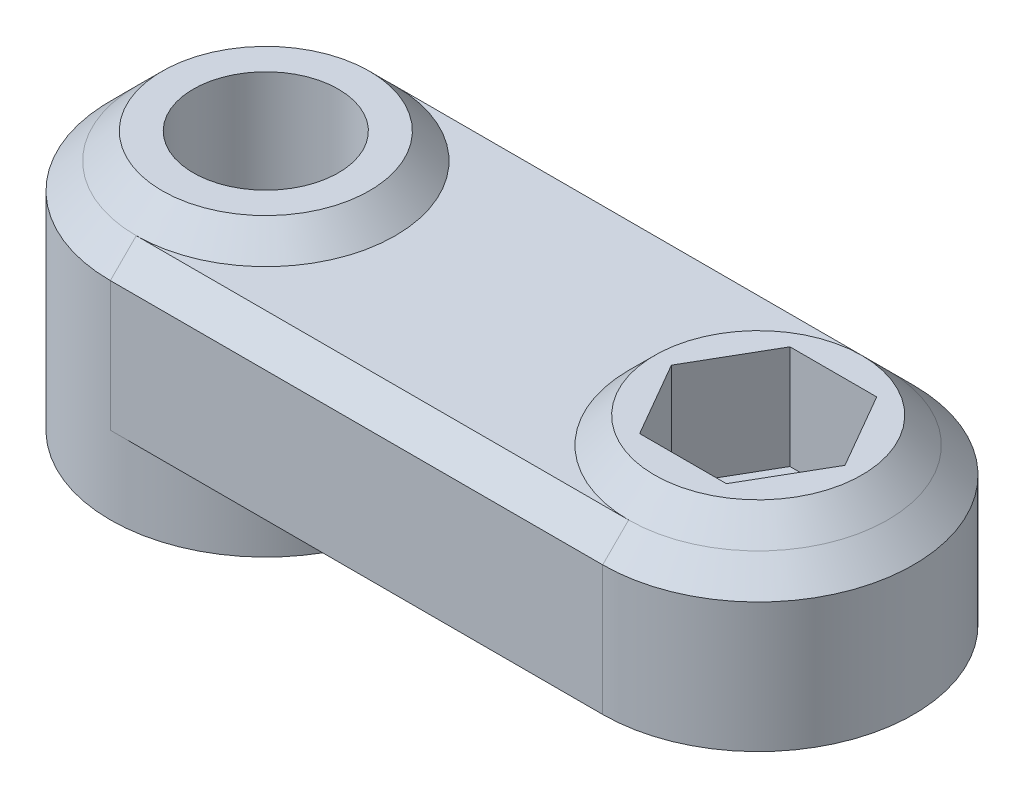
ISO-10303-21;
HEADER;
FILE_DESCRIPTION(('STEP AP214'),'2;1');
FILE_NAME('part.step','',(''),(''),'','','');
FILE_SCHEMA(('AUTOMOTIVE_DESIGN { 1 0 10303 214 1 1 1 1 }'));
ENDSEC;
DATA;
#1=APPLICATION_CONTEXT('core data for automotive mechanical design processes');
#2=APPLICATION_PROTOCOL_DEFINITION('international standard','automotive_design',2000,#1);
#3=PRODUCT_CONTEXT('',#1,'mechanical');
#4=PRODUCT('Part','Part','',(#3));
#5=PRODUCT_RELATED_PRODUCT_CATEGORY('part','',(#4));
#6=PRODUCT_DEFINITION_FORMATION('','',#4);
#7=PRODUCT_DEFINITION_CONTEXT('part definition',#1,'design');
#8=PRODUCT_DEFINITION('design','',#6,#7);
#9=PRODUCT_DEFINITION_SHAPE('','',#8);
#10=(LENGTH_UNIT() NAMED_UNIT(*) SI_UNIT(.MILLI.,.METRE.));
#11=(NAMED_UNIT(*) PLANE_ANGLE_UNIT() SI_UNIT($,.RADIAN.));
#12=(NAMED_UNIT(*) SI_UNIT($,.STERADIAN.) SOLID_ANGLE_UNIT());
#13=UNCERTAINTY_MEASURE_WITH_UNIT(LENGTH_MEASURE(1.E-05),#10,'distance_accuracy_value','');
#14=(GEOMETRIC_REPRESENTATION_CONTEXT(3) GLOBAL_UNCERTAINTY_ASSIGNED_CONTEXT((#13)) GLOBAL_UNIT_ASSIGNED_CONTEXT((#10,
#11,#12)) REPRESENTATION_CONTEXT('',''));
#15=CARTESIAN_POINT('',(0.,0.,0.));
#16=DIRECTION('',(0.,0.,1.));
#17=DIRECTION('',(1.,0.,0.));
#18=AXIS2_PLACEMENT_3D('',#15,#16,#17);
#19=CARTESIAN_POINT('',(0.,10.,0.));
#20=DIRECTION('',(0.,1.,0.));
#21=DIRECTION('',(0.,0.,1.));
#22=AXIS2_PLACEMENT_3D('',#19,#20,#21);
#23=PLANE('',#22);
#24=CARTESIAN_POINT('',(0.,10.,0.));
#25=DIRECTION('',(0.,-1.,0.));
#26=DIRECTION('',(0.,0.,-1.));
#27=AXIS2_PLACEMENT_3D('',#24,#25,#26);
#28=CIRCLE('',#27,2.8);
#29=CARTESIAN_POINT('',(0.,10.,-2.8));
#30=VERTEX_POINT('',#29);
#31=EDGE_CURVE('E314',#30,#30,#28,.T.);
#32=ORIENTED_EDGE('',*,*,#31,.T.);
#33=EDGE_LOOP('',(#32));
#34=FACE_BOUND('',#33,.T.);
#35=CARTESIAN_POINT('',(0.,10.,0.));
#36=DIRECTION('',(0.,1.,0.));
#37=DIRECTION('',(0.,0.,1.));
#38=AXIS2_PLACEMENT_3D('',#35,#36,#37);
#39=CIRCLE('',#38,4.);
#40=CARTESIAN_POINT('',(0.,10.,4.));
#41=VERTEX_POINT('',#40);
#42=EDGE_CURVE('E340',#41,#41,#39,.T.);
#43=ORIENTED_EDGE('',*,*,#42,.T.);
#44=EDGE_LOOP('',(#43));
#45=FACE_BOUND('',#44,.T.);
#46=ADVANCED_FACE('F41',(#34,#45),#23,.T.);
#47=DIRECTION('',(-0.5,0.,-0.866025403784439));
#48=VECTOR('',#47,1.);
#49=CARTESIAN_POINT('',(22.3486315612998,10.,0.));
#50=LINE('',#49,#48);
#51=CARTESIAN_POINT('',(22.3486315612998,10.,0.));
#52=VERTEX_POINT('',#51);
#53=CARTESIAN_POINT('',(20.6743157806499,10.,-2.9));
#54=VERTEX_POINT('',#53);
#55=EDGE_CURVE('E64',#52,#54,#50,.T.);
#56=ORIENTED_EDGE('',*,*,#55,.F.);
#57=DIRECTION('',(0.5,0.,-0.866025403784438));
#58=VECTOR('',#57,1.);
#59=CARTESIAN_POINT('',(20.6743157806499,10.,2.90000000000001));
#60=LINE('',#59,#58);
#61=CARTESIAN_POINT('',(20.6743157806499,10.,2.90000000000001));
#62=VERTEX_POINT('',#61);
#63=EDGE_CURVE('E379',#62,#52,#60,.T.);
#64=ORIENTED_EDGE('',*,*,#63,.F.);
#65=DIRECTION('',(1.,0.,0.));
#66=VECTOR('',#65,1.);
#67=CARTESIAN_POINT('',(17.3256842193501,10.,2.90000000000001));
#68=LINE('',#67,#66);
#69=CARTESIAN_POINT('',(17.3256842193501,10.,2.90000000000001));
#70=VERTEX_POINT('',#69);
#71=EDGE_CURVE('E410',#70,#62,#68,.T.);
#72=ORIENTED_EDGE('',*,*,#71,.F.);
#73=DIRECTION('',(0.5,0.,0.866025403784438));
#74=VECTOR('',#73,1.);
#75=CARTESIAN_POINT('',(15.6513684387002,10.,0.));
#76=LINE('',#75,#74);
#77=CARTESIAN_POINT('',(15.6513684387002,10.,0.));
#78=VERTEX_POINT('',#77);
#79=EDGE_CURVE('E406',#78,#70,#76,.T.);
#80=ORIENTED_EDGE('',*,*,#79,.F.);
#81=DIRECTION('',(-0.500000000000001,0.,0.866025403784438));
#82=VECTOR('',#81,1.);
#83=CARTESIAN_POINT('',(17.3256842193501,10.,-2.9));
#84=LINE('',#83,#82);
#85=CARTESIAN_POINT('',(17.3256842193501,10.,-2.9));
#86=VERTEX_POINT('',#85);
#87=EDGE_CURVE('E402',#86,#78,#84,.T.);
#88=ORIENTED_EDGE('',*,*,#87,.F.);
#89=DIRECTION('',(-1.,0.,0.));
#90=VECTOR('',#89,1.);
#91=CARTESIAN_POINT('',(20.6743157806499,10.,-2.9));
#92=LINE('',#91,#90);
#93=EDGE_CURVE('E370',#54,#86,#92,.T.);
#94=ORIENTED_EDGE('',*,*,#93,.F.);
#95=EDGE_LOOP('',(#56,#64,#72,#80,#88,#94));
#96=FACE_BOUND('',#95,.T.);
#97=CARTESIAN_POINT('',(19.,10.,0.));
#98=DIRECTION('',(0.,1.,0.));
#99=DIRECTION('',(0.,0.,1.));
#100=AXIS2_PLACEMENT_3D('',#97,#98,#99);
#101=CIRCLE('',#100,3.99999999999999);
#102=CARTESIAN_POINT('',(19.,10.,3.99999999999999));
#103=VERTEX_POINT('',#102);
#104=EDGE_CURVE('E336',#103,#103,#101,.T.);
#105=ORIENTED_EDGE('',*,*,#104,.T.);
#106=EDGE_LOOP('',(#105));
#107=FACE_BOUND('',#106,.T.);
#108=ADVANCED_FACE('F436',(#96,#107),#23,.T.);
#109=CARTESIAN_POINT('',(0.,10.,4.));
#110=DIRECTION('',(0.,0.707106781186546,0.707106781186549));
#111=DIRECTION('',(-1.,0.,0.));
#112=AXIS2_PLACEMENT_3D('',#109,#110,#111);
#113=PLANE('',#112);
#114=DIRECTION('',(0.,-0.707106781186549,0.707106781186546));
#115=VECTOR('',#114,1.);
#116=CARTESIAN_POINT('',(19.,10.,3.99999999999999));
#117=LINE('',#116,#115);
#118=CARTESIAN_POINT('',(19.,9.,4.99999999999999));
#119=VERTEX_POINT('',#118);
#120=CARTESIAN_POINT('',(19.,7.99999999999999,6.));
#121=VERTEX_POINT('',#120);
#122=EDGE_CURVE('E212',#119,#121,#117,.T.);
#123=ORIENTED_EDGE('',*,*,#122,.F.);
#124=DIRECTION('',(-1.,0.,0.));
#125=VECTOR('',#124,1.);
#126=CARTESIAN_POINT('',(0.,9.,4.99999999999999));
#127=LINE('',#126,#125);
#128=CARTESIAN_POINT('',(0.,9.,4.99999999999999));
#129=VERTEX_POINT('',#128);
#130=EDGE_CURVE('E365',#119,#129,#127,.T.);
#131=ORIENTED_EDGE('',*,*,#130,.T.);
#132=DIRECTION('',(0.,0.707106781186549,-0.707106781186546));
#133=VECTOR('',#132,1.);
#134=CARTESIAN_POINT('',(0.,7.99999999999999,6.));
#135=LINE('',#134,#133);
#136=CARTESIAN_POINT('',(0.,7.99999999999999,6.));
#137=VERTEX_POINT('',#136);
#138=EDGE_CURVE('E190',#137,#129,#135,.T.);
#139=ORIENTED_EDGE('',*,*,#138,.F.);
#140=DIRECTION('',(-1.,0.,0.));
#141=VECTOR('',#140,1.);
#142=CARTESIAN_POINT('',(0.,7.99999999999999,6.));
#143=LINE('',#142,#141);
#144=EDGE_CURVE('E181',#121,#137,#143,.T.);
#145=ORIENTED_EDGE('',*,*,#144,.F.);
#146=EDGE_LOOP('',(#123,#131,#139,#145));
#147=FACE_BOUND('',#146,.T.);
#148=ADVANCED_FACE('F364',(#147),#113,.T.);
#149=CARTESIAN_POINT('',(19.,10.,0.));
#150=DIRECTION('',(0.,-1.,0.));
#151=DIRECTION('',(0.,0.,-1.));
#152=AXIS2_PLACEMENT_3D('',#149,#150,#151);
#153=CONICAL_SURFACE('',#152,3.99999999999999,0.785398163397447);
#154=DIRECTION('',(0.,-0.707106781186549,-0.707106781186546));
#155=VECTOR('',#154,1.);
#156=CARTESIAN_POINT('',(19.,10.,-3.99999999999999));
#157=LINE('',#156,#155);
#158=CARTESIAN_POINT('',(19.,9.,-4.99999999999999));
#159=VERTEX_POINT('',#158);
#160=CARTESIAN_POINT('',(19.,7.99999999999999,-6.));
#161=VERTEX_POINT('',#160);
#162=EDGE_CURVE('E198',#159,#161,#157,.T.);
#163=ORIENTED_EDGE('',*,*,#162,.F.);
#164=CARTESIAN_POINT('',(19.,9.,0.));
#165=DIRECTION('',(0.,1.,0.));
#166=DIRECTION('',(0.,0.,1.));
#167=AXIS2_PLACEMENT_3D('',#164,#165,#166);
#168=CIRCLE('',#167,4.99999999999999);
#169=EDGE_CURVE('E57',#159,#119,#168,.F.);
#170=ORIENTED_EDGE('',*,*,#169,.T.);
#171=ORIENTED_EDGE('',*,*,#122,.T.);
#172=CARTESIAN_POINT('',(19.,7.99999999999999,0.));
#173=DIRECTION('',(0.,1.,0.));
#174=DIRECTION('',(0.,0.,1.));
#175=AXIS2_PLACEMENT_3D('',#172,#173,#174);
#176=CIRCLE('',#175,6.);
#177=EDGE_CURVE('E348',#161,#121,#176,.F.);
#178=ORIENTED_EDGE('',*,*,#177,.F.);
#179=EDGE_LOOP('',(#163,#170,#171,#178));
#180=FACE_BOUND('',#179,.T.);
#181=ADVANCED_FACE('F502',(#180),#153,.T.);
#182=CARTESIAN_POINT('',(0.,10.,0.));
#183=DIRECTION('',(0.,-1.,0.));
#184=DIRECTION('',(0.,0.,-1.));
#185=AXIS2_PLACEMENT_3D('',#182,#183,#184);
#186=CONICAL_SURFACE('',#185,4.,0.785398163397447);
#187=ORIENTED_EDGE('',*,*,#138,.T.);
#188=CARTESIAN_POINT('',(0.,9.,0.));
#189=DIRECTION('',(0.,1.,0.));
#190=DIRECTION('',(0.,0.,1.));
#191=AXIS2_PLACEMENT_3D('',#188,#189,#190);
#192=CIRCLE('',#191,4.99999999999999);
#193=CARTESIAN_POINT('',(0.,9.,-4.99999999999999));
#194=VERTEX_POINT('',#193);
#195=EDGE_CURVE('E170',#129,#194,#192,.F.);
#196=ORIENTED_EDGE('',*,*,#195,.T.);
#197=DIRECTION('',(0.,0.707106781186549,0.707106781186546));
#198=VECTOR('',#197,1.);
#199=CARTESIAN_POINT('',(0.,7.99999999999999,-6.));
#200=LINE('',#199,#198);
#201=CARTESIAN_POINT('',(0.,7.99999999999999,-6.));
#202=VERTEX_POINT('',#201);
#203=EDGE_CURVE('E188',#202,#194,#200,.T.);
#204=ORIENTED_EDGE('',*,*,#203,.F.);
#205=CARTESIAN_POINT('',(0.,7.99999999999999,0.));
#206=DIRECTION('',(0.,1.,0.));
#207=DIRECTION('',(0.,0.,1.));
#208=AXIS2_PLACEMENT_3D('',#205,#206,#207);
#209=CIRCLE('',#208,6.);
#210=EDGE_CURVE('E346',#137,#202,#209,.F.);
#211=ORIENTED_EDGE('',*,*,#210,.F.);
#212=EDGE_LOOP('',(#187,#196,#204,#211));
#213=FACE_BOUND('',#212,.T.);
#214=ADVANCED_FACE('F186',(#213),#186,.T.);
#215=CARTESIAN_POINT('',(0.,10.,-4.));
#216=DIRECTION('',(0.,0.707106781186546,-0.707106781186549));
#217=DIRECTION('',(1.,0.,0.));
#218=AXIS2_PLACEMENT_3D('',#215,#216,#217);
#219=PLANE('',#218);
#220=ORIENTED_EDGE('',*,*,#203,.T.);
#221=DIRECTION('',(1.,0.,0.));
#222=VECTOR('',#221,1.);
#223=CARTESIAN_POINT('',(0.,9.,-4.99999999999999));
#224=LINE('',#223,#222);
#225=EDGE_CURVE('E174',#194,#159,#224,.T.);
#226=ORIENTED_EDGE('',*,*,#225,.T.);
#227=ORIENTED_EDGE('',*,*,#162,.T.);
#228=DIRECTION('',(1.,0.,0.));
#229=VECTOR('',#228,1.);
#230=CARTESIAN_POINT('',(19.,7.99999999999999,-6.));
#231=LINE('',#230,#229);
#232=EDGE_CURVE('E196',#202,#161,#231,.T.);
#233=ORIENTED_EDGE('',*,*,#232,.F.);
#234=EDGE_LOOP('',(#220,#226,#227,#233));
#235=FACE_BOUND('',#234,.T.);
#236=ADVANCED_FACE('F194',(#235),#219,.T.);
#237=CARTESIAN_POINT('',(0.,10.,6.));
#238=DIRECTION('',(0.,0.,-1.));
#239=DIRECTION('',(-1.,0.,0.));
#240=AXIS2_PLACEMENT_3D('',#237,#238,#239);
#241=PLANE('',#240);
#242=DIRECTION('',(-1.,0.,0.));
#243=VECTOR('',#242,1.);
#244=CARTESIAN_POINT('',(0.,3.,6.));
#245=LINE('',#244,#243);
#246=CARTESIAN_POINT('',(19.,3.,6.));
#247=VERTEX_POINT('',#246);
#248=CARTESIAN_POINT('',(0.,3.,6.));
#249=VERTEX_POINT('',#248);
#250=EDGE_CURVE('E243',#247,#249,#245,.T.);
#251=ORIENTED_EDGE('',*,*,#250,.F.);
#252=DIRECTION('',(0.,-1.,0.));
#253=VECTOR('',#252,1.);
#254=CARTESIAN_POINT('',(19.,10.,6.));
#255=LINE('',#254,#253);
#256=EDGE_CURVE('E329',#121,#247,#255,.T.);
#257=ORIENTED_EDGE('',*,*,#256,.F.);
#258=ORIENTED_EDGE('',*,*,#144,.T.);
#259=DIRECTION('',(0.,-1.,0.));
#260=VECTOR('',#259,1.);
#261=CARTESIAN_POINT('',(0.,10.,6.));
#262=LINE('',#261,#260);
#263=EDGE_CURVE('E333',#137,#249,#262,.T.);
#264=ORIENTED_EDGE('',*,*,#263,.T.);
#265=EDGE_LOOP('',(#251,#257,#258,#264));
#266=FACE_BOUND('',#265,.T.);
#267=ADVANCED_FACE('F359',(#266),#241,.F.);
#268=CARTESIAN_POINT('',(19.,10.,0.));
#269=DIRECTION('',(0.,-1.,0.));
#270=DIRECTION('',(0.,0.,-1.));
#271=AXIS2_PLACEMENT_3D('',#268,#269,#270);
#272=CYLINDRICAL_SURFACE('',#271,6.);
#273=CARTESIAN_POINT('',(19.,3.,0.));
#274=DIRECTION('',(0.,-1.,0.));
#275=DIRECTION('',(0.,0.,-1.));
#276=AXIS2_PLACEMENT_3D('',#273,#274,#275);
#277=CIRCLE('',#276,6.);
#278=CARTESIAN_POINT('',(19.,3.,-6.));
#279=VERTEX_POINT('',#278);
#280=EDGE_CURVE('E225',#279,#247,#277,.T.);
#281=ORIENTED_EDGE('',*,*,#280,.F.);
#282=DIRECTION('',(0.,-1.,0.));
#283=VECTOR('',#282,1.);
#284=CARTESIAN_POINT('',(19.,10.,-6.));
#285=LINE('',#284,#283);
#286=EDGE_CURVE('E325',#161,#279,#285,.T.);
#287=ORIENTED_EDGE('',*,*,#286,.F.);
#288=ORIENTED_EDGE('',*,*,#177,.T.);
#289=ORIENTED_EDGE('',*,*,#256,.T.);
#290=EDGE_LOOP('',(#281,#287,#288,#289));
#291=FACE_BOUND('',#290,.T.);
#292=ADVANCED_FACE('F481',(#291),#272,.T.);
#293=CARTESIAN_POINT('',(0.,10.,-6.));
#294=DIRECTION('',(0.,0.,1.));
#295=DIRECTION('',(1.,0.,0.));
#296=AXIS2_PLACEMENT_3D('',#293,#294,#295);
#297=PLANE('',#296);
#298=DIRECTION('',(1.,0.,0.));
#299=VECTOR('',#298,1.);
#300=CARTESIAN_POINT('',(0.,3.,-6.));
#301=LINE('',#300,#299);
#302=CARTESIAN_POINT('',(0.,3.,-6.));
#303=VERTEX_POINT('',#302);
#304=EDGE_CURVE('E219',#303,#279,#301,.T.);
#305=ORIENTED_EDGE('',*,*,#304,.F.);
#306=DIRECTION('',(0.,-1.,0.));
#307=VECTOR('',#306,1.);
#308=CARTESIAN_POINT('',(0.,10.,-6.));
#309=LINE('',#308,#307);
#310=EDGE_CURVE('E322',#202,#303,#309,.T.);
#311=ORIENTED_EDGE('',*,*,#310,.F.);
#312=ORIENTED_EDGE('',*,*,#232,.T.);
#313=ORIENTED_EDGE('',*,*,#286,.T.);
#314=EDGE_LOOP('',(#305,#311,#312,#313));
#315=FACE_BOUND('',#314,.T.);
#316=ADVANCED_FACE('F477',(#315),#297,.F.);
#317=CARTESIAN_POINT('',(0.,0.,0.));
#318=DIRECTION('',(0.,1.,0.));
#319=DIRECTION('',(0.,0.,1.));
#320=AXIS2_PLACEMENT_3D('',#317,#318,#319);
#321=PLANE('',#320);
#322=DIRECTION('',(-1.,0.,0.));
#323=VECTOR('',#322,1.);
#324=CARTESIAN_POINT('',(2.10732848254213,0.,3.65));
#325=LINE('',#324,#323);
#326=CARTESIAN_POINT('',(2.10732848254213,0.,3.65));
#327=VERTEX_POINT('',#326);
#328=CARTESIAN_POINT('',(-2.10732848254214,0.,3.65));
#329=VERTEX_POINT('',#328);
#330=EDGE_CURVE('E275',#327,#329,#325,.T.);
#331=ORIENTED_EDGE('',*,*,#330,.F.);
#332=DIRECTION('',(-0.5,0.,0.866025403784438));
#333=VECTOR('',#332,1.);
#334=CARTESIAN_POINT('',(4.21465696508427,0.,0.));
#335=LINE('',#334,#333);
#336=CARTESIAN_POINT('',(4.21465696508427,0.,0.));
#337=VERTEX_POINT('',#336);
#338=EDGE_CURVE('E246',#337,#327,#335,.T.);
#339=ORIENTED_EDGE('',*,*,#338,.F.);
#340=DIRECTION('',(0.5,0.,0.866025403784438));
#341=VECTOR('',#340,1.);
#342=CARTESIAN_POINT('',(2.10732848254213,0.,-3.65));
#343=LINE('',#342,#341);
#344=CARTESIAN_POINT('',(2.10732848254213,0.,-3.65));
#345=VERTEX_POINT('',#344);
#346=EDGE_CURVE('E252',#345,#337,#343,.T.);
#347=ORIENTED_EDGE('',*,*,#346,.F.);
#348=DIRECTION('',(1.,0.,0.));
#349=VECTOR('',#348,1.);
#350=CARTESIAN_POINT('',(-2.10732848254213,0.,-3.65));
#351=LINE('',#350,#349);
#352=CARTESIAN_POINT('',(-2.10732848254213,0.,-3.65));
#353=VERTEX_POINT('',#352);
#354=EDGE_CURVE('E287',#353,#345,#351,.T.);
#355=ORIENTED_EDGE('',*,*,#354,.F.);
#356=DIRECTION('',(0.5,0.,-0.866025403784439));
#357=VECTOR('',#356,1.);
#358=CARTESIAN_POINT('',(-4.21465696508427,0.,0.));
#359=LINE('',#358,#357);
#360=CARTESIAN_POINT('',(-4.21465696508427,0.,0.));
#361=VERTEX_POINT('',#360);
#362=EDGE_CURVE('E283',#361,#353,#359,.T.);
#363=ORIENTED_EDGE('',*,*,#362,.F.);
#364=DIRECTION('',(-0.5,0.,-0.866025403784439));
#365=VECTOR('',#364,1.);
#366=CARTESIAN_POINT('',(-2.10732848254214,0.,3.65));
#367=LINE('',#366,#365);
#368=EDGE_CURVE('E279',#329,#361,#367,.T.);
#369=ORIENTED_EDGE('',*,*,#368,.F.);
#370=EDGE_LOOP('',(#331,#339,#347,#355,#363,#369));
#371=FACE_BOUND('',#370,.T.);
#372=CARTESIAN_POINT('',(0.,0.,0.));
#373=DIRECTION('',(0.,1.,0.));
#374=DIRECTION('',(0.,0.,1.));
#375=AXIS2_PLACEMENT_3D('',#372,#373,#374);
#376=CIRCLE('',#375,6.);
#377=CARTESIAN_POINT('',(0.,0.,6.));
#378=VERTEX_POINT('',#377);
#379=EDGE_CURVE('E318',#378,#378,#376,.T.);
#380=ORIENTED_EDGE('',*,*,#379,.F.);
#381=EDGE_LOOP('',(#380));
#382=FACE_BOUND('',#381,.T.);
#383=ADVANCED_FACE('F473',(#371,#382),#321,.F.);
#384=CARTESIAN_POINT('',(19.,0.,0.));
#385=DIRECTION('',(0.,-1.,0.));
#386=DIRECTION('',(0.,0.,-1.));
#387=AXIS2_PLACEMENT_3D('',#384,#385,#386);
#388=CYLINDRICAL_SURFACE('',#387,2.325);
#389=CARTESIAN_POINT('',(19.,6.,0.));
#390=DIRECTION('',(0.,-1.,0.));
#391=DIRECTION('',(0.,0.,-1.));
#392=AXIS2_PLACEMENT_3D('',#389,#390,#391);
#393=CIRCLE('',#392,2.325);
#394=CARTESIAN_POINT('',(19.,6.,-2.325));
#395=VERTEX_POINT('',#394);
#396=EDGE_CURVE('E215',#395,#395,#393,.T.);
#397=ORIENTED_EDGE('',*,*,#396,.F.);
#398=EDGE_LOOP('',(#397));
#399=FACE_BOUND('',#398,.T.);
#400=CARTESIAN_POINT('',(19.,3.,0.));
#401=DIRECTION('',(0.,-1.,0.));
#402=DIRECTION('',(0.,0.,-1.));
#403=AXIS2_PLACEMENT_3D('',#400,#401,#402);
#404=CIRCLE('',#403,2.325);
#405=CARTESIAN_POINT('',(19.,3.,-2.325));
#406=VERTEX_POINT('',#405);
#407=EDGE_CURVE('E216',#406,#406,#404,.T.);
#408=ORIENTED_EDGE('',*,*,#407,.T.);
#409=EDGE_LOOP('',(#408));
#410=FACE_BOUND('',#409,.T.);
#411=ADVANCED_FACE('F476',(#399,#410),#388,.F.);
#412=CARTESIAN_POINT('',(0.,10.,0.));
#413=DIRECTION('',(0.,-1.,0.));
#414=DIRECTION('',(0.,0.,-1.));
#415=AXIS2_PLACEMENT_3D('',#412,#413,#414);
#416=CYLINDRICAL_SURFACE('',#415,6.);
#417=ORIENTED_EDGE('',*,*,#379,.T.);
#418=EDGE_LOOP('',(#417));
#419=FACE_BOUND('',#418,.T.);
#420=CARTESIAN_POINT('',(0.,3.,0.));
#421=DIRECTION('',(0.,-1.,0.));
#422=DIRECTION('',(0.,0.,-1.));
#423=AXIS2_PLACEMENT_3D('',#420,#421,#422);
#424=CIRCLE('',#423,6.);
#425=EDGE_CURVE('E220',#303,#249,#424,.T.);
#426=ORIENTED_EDGE('',*,*,#425,.T.);
#427=ORIENTED_EDGE('',*,*,#263,.F.);
#428=ORIENTED_EDGE('',*,*,#210,.T.);
#429=ORIENTED_EDGE('',*,*,#310,.T.);
#430=EDGE_LOOP('',(#426,#427,#428,#429));
#431=FACE_BOUND('',#430,.T.);
#432=ADVANCED_FACE('F362',(#419,#431),#416,.T.);
#433=CARTESIAN_POINT('',(0.,-1.42756695835224,0.));
#434=DIRECTION('',(0.,-1.,0.));
#435=DIRECTION('',(0.,0.,-1.));
#436=AXIS2_PLACEMENT_3D('',#433,#434,#435);
#437=CYLINDRICAL_SURFACE('',#436,2.8);
#438=CARTESIAN_POINT('',(0.,5.,0.));
#439=DIRECTION('',(0.,-1.,0.));
#440=DIRECTION('',(0.,0.,-1.));
#441=AXIS2_PLACEMENT_3D('',#438,#439,#440);
#442=CIRCLE('',#441,2.8);
#443=CARTESIAN_POINT('',(0.,5.,-2.8));
#444=VERTEX_POINT('',#443);
#445=EDGE_CURVE('E199',#444,#444,#442,.T.);
#446=ORIENTED_EDGE('',*,*,#445,.T.);
#447=EDGE_LOOP('',(#446));
#448=FACE_BOUND('',#447,.T.);
#449=ORIENTED_EDGE('',*,*,#31,.F.);
#450=EDGE_LOOP('',(#449));
#451=FACE_BOUND('',#450,.T.);
#452=ADVANCED_FACE('F471',(#448,#451),#437,.F.);
#453=CARTESIAN_POINT('',(16.675,6.,0.));
#454=DIRECTION('',(0.,1.,0.));
#455=DIRECTION('',(0.,0.,1.));
#456=AXIS2_PLACEMENT_3D('',#453,#454,#455);
#457=PLANE('',#456);
#458=ORIENTED_EDGE('',*,*,#396,.T.);
#459=EDGE_LOOP('',(#458));
#460=FACE_BOUND('',#459,.T.);
#461=DIRECTION('',(-0.5,0.,-0.866025403784439));
#462=VECTOR('',#461,1.);
#463=CARTESIAN_POINT('',(22.3486315612998,6.,0.));
#464=LINE('',#463,#462);
#465=CARTESIAN_POINT('',(22.3486315612998,6.,0.));
#466=VERTEX_POINT('',#465);
#467=CARTESIAN_POINT('',(20.6743157806499,6.,-2.9));
#468=VERTEX_POINT('',#467);
#469=EDGE_CURVE('E374',#466,#468,#464,.T.);
#470=ORIENTED_EDGE('',*,*,#469,.T.);
#471=DIRECTION('',(-1.,0.,0.));
#472=VECTOR('',#471,1.);
#473=CARTESIAN_POINT('',(20.6743157806499,6.,-2.9));
#474=LINE('',#473,#472);
#475=CARTESIAN_POINT('',(17.3256842193501,6.,-2.9));
#476=VERTEX_POINT('',#475);
#477=EDGE_CURVE('E378',#468,#476,#474,.T.);
#478=ORIENTED_EDGE('',*,*,#477,.T.);
#479=DIRECTION('',(-0.500000000000001,0.,0.866025403784438));
#480=VECTOR('',#479,1.);
#481=CARTESIAN_POINT('',(17.3256842193501,6.,-2.9));
#482=LINE('',#481,#480);
#483=CARTESIAN_POINT('',(15.6513684387002,6.,0.));
#484=VERTEX_POINT('',#483);
#485=EDGE_CURVE('E383',#476,#484,#482,.T.);
#486=ORIENTED_EDGE('',*,*,#485,.T.);
#487=DIRECTION('',(0.5,0.,0.866025403784438));
#488=VECTOR('',#487,1.);
#489=CARTESIAN_POINT('',(15.6513684387002,6.,0.));
#490=LINE('',#489,#488);
#491=CARTESIAN_POINT('',(17.3256842193501,6.,2.90000000000001));
#492=VERTEX_POINT('',#491);
#493=EDGE_CURVE('E387',#484,#492,#490,.T.);
#494=ORIENTED_EDGE('',*,*,#493,.T.);
#495=DIRECTION('',(1.,0.,0.));
#496=VECTOR('',#495,1.);
#497=CARTESIAN_POINT('',(17.3256842193501,6.,2.90000000000001));
#498=LINE('',#497,#496);
#499=CARTESIAN_POINT('',(20.6743157806499,6.,2.90000000000001));
#500=VERTEX_POINT('',#499);
#501=EDGE_CURVE('E391',#492,#500,#498,.T.);
#502=ORIENTED_EDGE('',*,*,#501,.T.);
#503=DIRECTION('',(0.5,0.,-0.866025403784438));
#504=VECTOR('',#503,1.);
#505=CARTESIAN_POINT('',(20.6743157806499,6.,2.90000000000001));
#506=LINE('',#505,#504);
#507=EDGE_CURVE('E395',#500,#466,#506,.T.);
#508=ORIENTED_EDGE('',*,*,#507,.T.);
#509=EDGE_LOOP('',(#470,#478,#486,#494,#502,#508));
#510=FACE_BOUND('',#509,.T.);
#511=ADVANCED_FACE('F447',(#460,#510),#457,.T.);
#512=CARTESIAN_POINT('',(4.21465696508427,5.,0.));
#513=DIRECTION('',(0.866025403784438,0.,0.5));
#514=DIRECTION('',(0.5,0.,-0.866025403784439));
#515=AXIS2_PLACEMENT_3D('',#512,#513,#514);
#516=PLANE('',#515);
#517=ORIENTED_EDGE('',*,*,#338,.T.);
#518=DIRECTION('',(0.,-1.,0.));
#519=VECTOR('',#518,1.);
#520=CARTESIAN_POINT('',(2.10732848254213,5.,3.65));
#521=LINE('',#520,#519);
#522=CARTESIAN_POINT('',(2.10732848254213,5.,3.65));
#523=VERTEX_POINT('',#522);
#524=EDGE_CURVE('E272',#523,#327,#521,.T.);
#525=ORIENTED_EDGE('',*,*,#524,.F.);
#526=DIRECTION('',(-0.5,0.,0.866025403784438));
#527=VECTOR('',#526,1.);
#528=CARTESIAN_POINT('',(4.21465696508427,5.,0.));
#529=LINE('',#528,#527);
#530=CARTESIAN_POINT('',(4.21465696508427,5.,0.));
#531=VERTEX_POINT('',#530);
#532=EDGE_CURVE('E247',#531,#523,#529,.T.);
#533=ORIENTED_EDGE('',*,*,#532,.F.);
#534=DIRECTION('',(0.,-1.,0.));
#535=VECTOR('',#534,1.);
#536=CARTESIAN_POINT('',(4.21465696508427,5.,0.));
#537=LINE('',#536,#535);
#538=EDGE_CURVE('E205',#531,#337,#537,.T.);
#539=ORIENTED_EDGE('',*,*,#538,.T.);
#540=EDGE_LOOP('',(#517,#525,#533,#539));
#541=FACE_BOUND('',#540,.T.);
#542=ADVANCED_FACE('F547',(#541),#516,.F.);
#543=CARTESIAN_POINT('',(2.10732848254213,5.,-3.65));
#544=DIRECTION('',(0.866025403784439,0.,-0.5));
#545=DIRECTION('',(-0.5,0.,-0.866025403784439));
#546=AXIS2_PLACEMENT_3D('',#543,#544,#545);
#547=PLANE('',#546);
#548=ORIENTED_EDGE('',*,*,#346,.T.);
#549=ORIENTED_EDGE('',*,*,#538,.F.);
#550=DIRECTION('',(0.5,0.,0.866025403784438));
#551=VECTOR('',#550,1.);
#552=CARTESIAN_POINT('',(2.10732848254213,5.,-3.65));
#553=LINE('',#552,#551);
#554=CARTESIAN_POINT('',(2.10732848254213,5.,-3.65));
#555=VERTEX_POINT('',#554);
#556=EDGE_CURVE('E268',#555,#531,#553,.T.);
#557=ORIENTED_EDGE('',*,*,#556,.F.);
#558=DIRECTION('',(0.,-1.,0.));
#559=VECTOR('',#558,1.);
#560=CARTESIAN_POINT('',(2.10732848254213,5.,-3.65));
#561=LINE('',#560,#559);
#562=EDGE_CURVE('E296',#555,#345,#561,.T.);
#563=ORIENTED_EDGE('',*,*,#562,.T.);
#564=EDGE_LOOP('',(#548,#549,#557,#563));
#565=FACE_BOUND('',#564,.T.);
#566=ADVANCED_FACE('F543',(#565),#547,.F.);
#567=CARTESIAN_POINT('',(-2.10732848254213,5.,-3.65));
#568=DIRECTION('',(0.,0.,-1.));
#569=DIRECTION('',(-1.,0.,0.));
#570=AXIS2_PLACEMENT_3D('',#567,#568,#569);
#571=PLANE('',#570);
#572=ORIENTED_EDGE('',*,*,#354,.T.);
#573=ORIENTED_EDGE('',*,*,#562,.F.);
#574=DIRECTION('',(1.,0.,0.));
#575=VECTOR('',#574,1.);
#576=CARTESIAN_POINT('',(-2.10732848254213,5.,-3.65));
#577=LINE('',#576,#575);
#578=CARTESIAN_POINT('',(-2.10732848254213,5.,-3.65));
#579=VERTEX_POINT('',#578);
#580=EDGE_CURVE('E264',#579,#555,#577,.T.);
#581=ORIENTED_EDGE('',*,*,#580,.F.);
#582=DIRECTION('',(0.,-1.,0.));
#583=VECTOR('',#582,1.);
#584=CARTESIAN_POINT('',(-2.10732848254213,5.,-3.65));
#585=LINE('',#584,#583);
#586=EDGE_CURVE('E299',#579,#353,#585,.T.);
#587=ORIENTED_EDGE('',*,*,#586,.T.);
#588=EDGE_LOOP('',(#572,#573,#581,#587));
#589=FACE_BOUND('',#588,.T.);
#590=ADVANCED_FACE('F546',(#589),#571,.F.);
#591=CARTESIAN_POINT('',(-4.21465696508427,5.,0.));
#592=DIRECTION('',(-0.866025403784439,0.,-0.5));
#593=DIRECTION('',(-0.5,0.,0.866025403784439));
#594=AXIS2_PLACEMENT_3D('',#591,#592,#593);
#595=PLANE('',#594);
#596=ORIENTED_EDGE('',*,*,#362,.T.);
#597=ORIENTED_EDGE('',*,*,#586,.F.);
#598=DIRECTION('',(0.5,0.,-0.866025403784439));
#599=VECTOR('',#598,1.);
#600=CARTESIAN_POINT('',(-4.21465696508427,5.,0.));
#601=LINE('',#600,#599);
#602=CARTESIAN_POINT('',(-4.21465696508427,5.,0.));
#603=VERTEX_POINT('',#602);
#604=EDGE_CURVE('E260',#603,#579,#601,.T.);
#605=ORIENTED_EDGE('',*,*,#604,.F.);
#606=DIRECTION('',(0.,-1.,0.));
#607=VECTOR('',#606,1.);
#608=CARTESIAN_POINT('',(-4.21465696508427,5.,0.));
#609=LINE('',#608,#607);
#610=EDGE_CURVE('E302',#603,#361,#609,.T.);
#611=ORIENTED_EDGE('',*,*,#610,.T.);
#612=EDGE_LOOP('',(#596,#597,#605,#611));
#613=FACE_BOUND('',#612,.T.);
#614=ADVANCED_FACE('F551',(#613),#595,.F.);
#615=CARTESIAN_POINT('',(-2.10732848254214,5.,3.65));
#616=DIRECTION('',(-0.866025403784439,0.,0.5));
#617=DIRECTION('',(0.5,0.,0.866025403784439));
#618=AXIS2_PLACEMENT_3D('',#615,#616,#617);
#619=PLANE('',#618);
#620=ORIENTED_EDGE('',*,*,#368,.T.);
#621=ORIENTED_EDGE('',*,*,#610,.F.);
#622=DIRECTION('',(-0.5,0.,-0.866025403784439));
#623=VECTOR('',#622,1.);
#624=CARTESIAN_POINT('',(-2.10732848254214,5.,3.65));
#625=LINE('',#624,#623);
#626=CARTESIAN_POINT('',(-2.10732848254214,5.,3.65));
#627=VERTEX_POINT('',#626);
#628=EDGE_CURVE('E256',#627,#603,#625,.T.);
#629=ORIENTED_EDGE('',*,*,#628,.F.);
#630=DIRECTION('',(0.,-1.,0.));
#631=VECTOR('',#630,1.);
#632=CARTESIAN_POINT('',(-2.10732848254214,5.,3.65));
#633=LINE('',#632,#631);
#634=EDGE_CURVE('E305',#627,#329,#633,.T.);
#635=ORIENTED_EDGE('',*,*,#634,.T.);
#636=EDGE_LOOP('',(#620,#621,#629,#635));
#637=FACE_BOUND('',#636,.T.);
#638=ADVANCED_FACE('F555',(#637),#619,.F.);
#639=CARTESIAN_POINT('',(2.10732848254213,5.,3.65));
#640=DIRECTION('',(0.,0.,1.));
#641=DIRECTION('',(1.,0.,0.));
#642=AXIS2_PLACEMENT_3D('',#639,#640,#641);
#643=PLANE('',#642);
#644=ORIENTED_EDGE('',*,*,#330,.T.);
#645=ORIENTED_EDGE('',*,*,#634,.F.);
#646=DIRECTION('',(-1.,0.,0.));
#647=VECTOR('',#646,1.);
#648=CARTESIAN_POINT('',(2.10732848254213,5.,3.65));
#649=LINE('',#648,#647);
#650=EDGE_CURVE('E251',#523,#627,#649,.T.);
#651=ORIENTED_EDGE('',*,*,#650,.F.);
#652=ORIENTED_EDGE('',*,*,#524,.T.);
#653=EDGE_LOOP('',(#644,#645,#651,#652));
#654=FACE_BOUND('',#653,.T.);
#655=ADVANCED_FACE('F541',(#654),#643,.F.);
#656=CARTESIAN_POINT('',(0.,5.,0.));
#657=DIRECTION('',(0.,-1.,0.));
#658=DIRECTION('',(0.,0.,-1.));
#659=AXIS2_PLACEMENT_3D('',#656,#657,#658);
#660=PLANE('',#659);
#661=ORIENTED_EDGE('',*,*,#445,.F.);
#662=EDGE_LOOP('',(#661));
#663=FACE_BOUND('',#662,.T.);
#664=ORIENTED_EDGE('',*,*,#532,.T.);
#665=ORIENTED_EDGE('',*,*,#650,.T.);
#666=ORIENTED_EDGE('',*,*,#628,.T.);
#667=ORIENTED_EDGE('',*,*,#604,.T.);
#668=ORIENTED_EDGE('',*,*,#580,.T.);
#669=ORIENTED_EDGE('',*,*,#556,.T.);
#670=EDGE_LOOP('',(#664,#665,#666,#667,#668,#669));
#671=FACE_BOUND('',#670,.T.);
#672=ADVANCED_FACE('F537',(#663,#671),#660,.T.);
#673=CARTESIAN_POINT('',(0.,3.,0.));
#674=DIRECTION('',(0.,-1.,0.));
#675=DIRECTION('',(0.,0.,-1.));
#676=AXIS2_PLACEMENT_3D('',#673,#674,#675);
#677=PLANE('',#676);
#678=ORIENTED_EDGE('',*,*,#407,.F.);
#679=EDGE_LOOP('',(#678));
#680=FACE_BOUND('',#679,.T.);
#681=ORIENTED_EDGE('',*,*,#250,.T.);
#682=ORIENTED_EDGE('',*,*,#425,.F.);
#683=ORIENTED_EDGE('',*,*,#304,.T.);
#684=ORIENTED_EDGE('',*,*,#280,.T.);
#685=EDGE_LOOP('',(#681,#682,#683,#684));
#686=FACE_BOUND('',#685,.T.);
#687=ADVANCED_FACE('F534',(#680,#686),#677,.T.);
#688=CARTESIAN_POINT('',(22.3486315612998,6.,0.));
#689=DIRECTION('',(0.866025403784439,0.,-0.5));
#690=DIRECTION('',(-0.5,0.,-0.866025403784439));
#691=AXIS2_PLACEMENT_3D('',#688,#689,#690);
#692=PLANE('',#691);
#693=ORIENTED_EDGE('',*,*,#55,.T.);
#694=DIRECTION('',(0.,1.,0.));
#695=VECTOR('',#694,1.);
#696=CARTESIAN_POINT('',(20.6743157806499,6.,-2.9));
#697=LINE('',#696,#695);
#698=EDGE_CURVE('E238',#468,#54,#697,.T.);
#699=ORIENTED_EDGE('',*,*,#698,.F.);
#700=ORIENTED_EDGE('',*,*,#469,.F.);
#701=DIRECTION('',(0.,1.,0.));
#702=VECTOR('',#701,1.);
#703=CARTESIAN_POINT('',(22.3486315612998,6.,0.));
#704=LINE('',#703,#702);
#705=EDGE_CURVE('E228',#466,#52,#704,.T.);
#706=ORIENTED_EDGE('',*,*,#705,.T.);
#707=EDGE_LOOP('',(#693,#699,#700,#706));
#708=FACE_BOUND('',#707,.T.);
#709=ADVANCED_FACE('F449',(#708),#692,.F.);
#710=CARTESIAN_POINT('',(20.6743157806499,6.,2.90000000000001));
#711=DIRECTION('',(0.866025403784438,0.,0.5));
#712=DIRECTION('',(0.5,0.,-0.866025403784438));
#713=AXIS2_PLACEMENT_3D('',#710,#711,#712);
#714=PLANE('',#713);
#715=ORIENTED_EDGE('',*,*,#63,.T.);
#716=ORIENTED_EDGE('',*,*,#705,.F.);
#717=ORIENTED_EDGE('',*,*,#507,.F.);
#718=DIRECTION('',(0.,1.,0.));
#719=VECTOR('',#718,1.);
#720=CARTESIAN_POINT('',(20.6743157806499,6.,2.90000000000001));
#721=LINE('',#720,#719);
#722=EDGE_CURVE('E235',#500,#62,#721,.T.);
#723=ORIENTED_EDGE('',*,*,#722,.T.);
#724=EDGE_LOOP('',(#715,#716,#717,#723));
#725=FACE_BOUND('',#724,.T.);
#726=ADVANCED_FACE('F451',(#725),#714,.F.);
#727=CARTESIAN_POINT('',(17.3256842193501,6.,2.90000000000001));
#728=DIRECTION('',(0.,0.,1.));
#729=DIRECTION('',(1.,0.,0.));
#730=AXIS2_PLACEMENT_3D('',#727,#728,#729);
#731=PLANE('',#730);
#732=ORIENTED_EDGE('',*,*,#71,.T.);
#733=ORIENTED_EDGE('',*,*,#722,.F.);
#734=ORIENTED_EDGE('',*,*,#501,.F.);
#735=DIRECTION('',(0.,1.,0.));
#736=VECTOR('',#735,1.);
#737=CARTESIAN_POINT('',(17.3256842193501,6.,2.90000000000001));
#738=LINE('',#737,#736);
#739=EDGE_CURVE('E419',#492,#70,#738,.T.);
#740=ORIENTED_EDGE('',*,*,#739,.T.);
#741=EDGE_LOOP('',(#732,#733,#734,#740));
#742=FACE_BOUND('',#741,.T.);
#743=ADVANCED_FACE('F453',(#742),#731,.F.);
#744=CARTESIAN_POINT('',(15.6513684387002,6.,0.));
#745=DIRECTION('',(-0.866025403784439,0.,0.5));
#746=DIRECTION('',(0.5,0.,0.866025403784439));
#747=AXIS2_PLACEMENT_3D('',#744,#745,#746);
#748=PLANE('',#747);
#749=ORIENTED_EDGE('',*,*,#79,.T.);
#750=ORIENTED_EDGE('',*,*,#739,.F.);
#751=ORIENTED_EDGE('',*,*,#493,.F.);
#752=DIRECTION('',(0.,1.,0.));
#753=VECTOR('',#752,1.);
#754=CARTESIAN_POINT('',(15.6513684387002,6.,0.));
#755=LINE('',#754,#753);
#756=EDGE_CURVE('E422',#484,#78,#755,.T.);
#757=ORIENTED_EDGE('',*,*,#756,.T.);
#758=EDGE_LOOP('',(#749,#750,#751,#757));
#759=FACE_BOUND('',#758,.T.);
#760=ADVANCED_FACE('F444',(#759),#748,.F.);
#761=CARTESIAN_POINT('',(17.3256842193501,6.,-2.9));
#762=DIRECTION('',(-0.866025403784438,0.,-0.500000000000001));
#763=DIRECTION('',(-0.500000000000001,0.,0.866025403784438));
#764=AXIS2_PLACEMENT_3D('',#761,#762,#763);
#765=PLANE('',#764);
#766=ORIENTED_EDGE('',*,*,#87,.T.);
#767=ORIENTED_EDGE('',*,*,#756,.F.);
#768=ORIENTED_EDGE('',*,*,#485,.F.);
#769=DIRECTION('',(0.,1.,0.));
#770=VECTOR('',#769,1.);
#771=CARTESIAN_POINT('',(17.3256842193501,6.,-2.9));
#772=LINE('',#771,#770);
#773=EDGE_CURVE('E424',#476,#86,#772,.T.);
#774=ORIENTED_EDGE('',*,*,#773,.T.);
#775=EDGE_LOOP('',(#766,#767,#768,#774));
#776=FACE_BOUND('',#775,.T.);
#777=ADVANCED_FACE('F441',(#776),#765,.F.);
#778=CARTESIAN_POINT('',(20.6743157806499,6.,-2.9));
#779=DIRECTION('',(0.,0.,-1.));
#780=DIRECTION('',(-1.,0.,0.));
#781=AXIS2_PLACEMENT_3D('',#778,#779,#780);
#782=PLANE('',#781);
#783=ORIENTED_EDGE('',*,*,#93,.T.);
#784=ORIENTED_EDGE('',*,*,#773,.F.);
#785=ORIENTED_EDGE('',*,*,#477,.F.);
#786=ORIENTED_EDGE('',*,*,#698,.T.);
#787=EDGE_LOOP('',(#783,#784,#785,#786));
#788=FACE_BOUND('',#787,.T.);
#789=ADVANCED_FACE('F432',(#788),#782,.F.);
#790=CARTESIAN_POINT('',(0.,9.,0.));
#791=DIRECTION('',(0.,1.,0.));
#792=DIRECTION('',(0.,0.,1.));
#793=AXIS2_PLACEMENT_3D('',#790,#791,#792);
#794=PLANE('',#793);
#795=ORIENTED_EDGE('',*,*,#130,.F.);
#796=CARTESIAN_POINT('',(19.,9.,0.));
#797=DIRECTION('',(0.,1.,0.));
#798=DIRECTION('',(0.,0.,1.));
#799=AXIS2_PLACEMENT_3D('',#796,#797,#798);
#800=CIRCLE('',#799,4.99999999999999);
#801=EDGE_CURVE('E11',#119,#159,#800,.F.);
#802=ORIENTED_EDGE('',*,*,#801,.T.);
#803=ORIENTED_EDGE('',*,*,#225,.F.);
#804=CARTESIAN_POINT('',(0.,9.,0.));
#805=DIRECTION('',(0.,1.,0.));
#806=DIRECTION('',(0.,0.,1.));
#807=AXIS2_PLACEMENT_3D('',#804,#805,#806);
#808=CIRCLE('',#807,4.99999999999999);
#809=EDGE_CURVE('E51',#194,#129,#808,.F.);
#810=ORIENTED_EDGE('',*,*,#809,.T.);
#811=EDGE_LOOP('',(#795,#802,#803,#810));
#812=FACE_BOUND('',#811,.T.);
#813=ADVANCED_FACE('F176',(#812),#794,.T.);
#814=CARTESIAN_POINT('',(19.,10.,0.));
#815=DIRECTION('',(0.,-1.,0.));
#816=DIRECTION('',(0.,0.,-1.));
#817=AXIS2_PLACEMENT_3D('',#814,#815,#816);
#818=CONICAL_SURFACE('',#817,3.99999999999999,0.785398163397443);
#819=ORIENTED_EDGE('',*,*,#169,.F.);
#820=ORIENTED_EDGE('',*,*,#801,.F.);
#821=EDGE_LOOP('',(#819,#820));
#822=FACE_BOUND('',#821,.T.);
#823=ORIENTED_EDGE('',*,*,#104,.F.);
#824=EDGE_LOOP('',(#823));
#825=FACE_BOUND('',#824,.T.);
#826=ADVANCED_FACE('F512',(#822,#825),#818,.T.);
#827=CARTESIAN_POINT('',(0.,10.,0.));
#828=DIRECTION('',(0.,-1.,0.));
#829=DIRECTION('',(0.,0.,-1.));
#830=AXIS2_PLACEMENT_3D('',#827,#828,#829);
#831=CONICAL_SURFACE('',#830,3.99999999999999,0.785398163397443);
#832=ORIENTED_EDGE('',*,*,#809,.F.);
#833=ORIENTED_EDGE('',*,*,#195,.F.);
#834=EDGE_LOOP('',(#832,#833));
#835=FACE_BOUND('',#834,.T.);
#836=ORIENTED_EDGE('',*,*,#42,.F.);
#837=EDGE_LOOP('',(#836));
#838=FACE_BOUND('',#837,.T.);
#839=ADVANCED_FACE('F44',(#835,#838),#831,.T.);
#840=CLOSED_SHELL('',(#46,#108,#148,#181,#214,#236,#267,#292,#316,#383,#411,#432,#452,#511,#542,
#566,#590,#614,#638,#655,#672,#687,#709,#726,#743,#760,#777,#789,#813,#826,#839));
#841=MANIFOLD_SOLID_BREP('B2',#840);
#842=ADVANCED_BREP_SHAPE_REPRESENTATION('',(#18,#841),#14);
#843=SHAPE_DEFINITION_REPRESENTATION(#9,#842);
ENDSEC;
END-ISO-10303-21;
